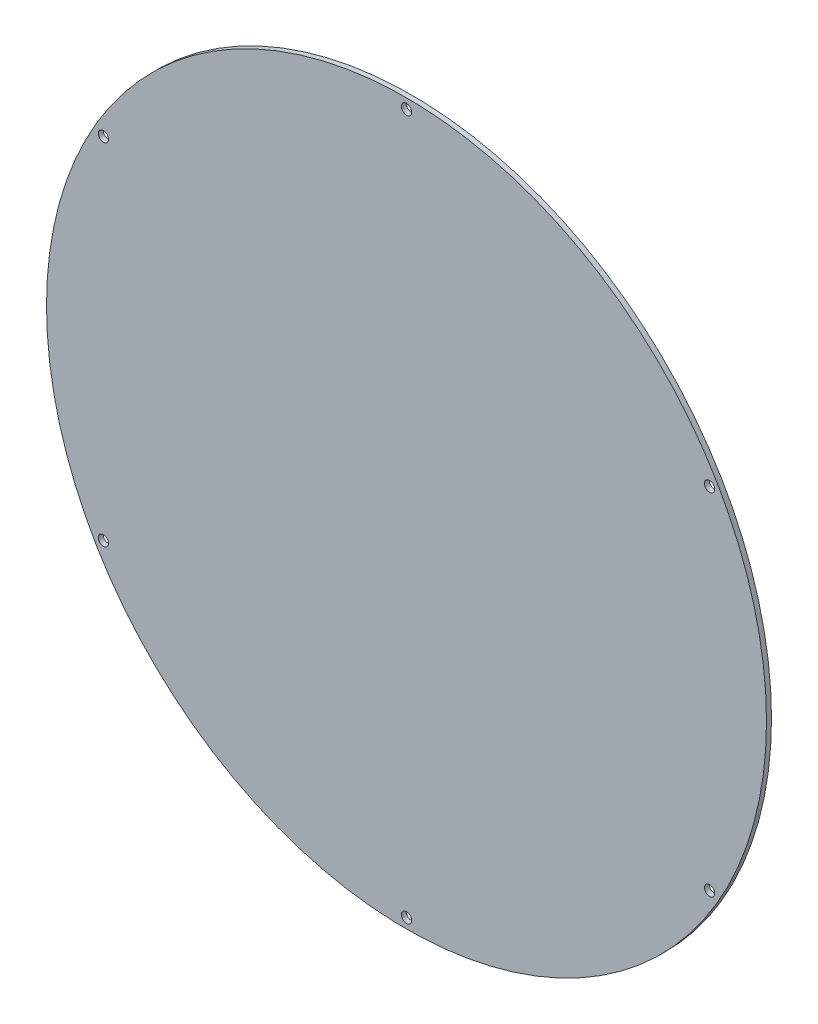
ISO-10303-21;
HEADER;
FILE_DESCRIPTION(('STEP AP214'),'2;1');
FILE_NAME('part.step','',(''),(''),'','','');
FILE_SCHEMA(('AUTOMOTIVE_DESIGN { 1 0 10303 214 1 1 1 1 }'));
ENDSEC;
DATA;
#1=APPLICATION_CONTEXT('core data for automotive mechanical design processes');
#2=APPLICATION_PROTOCOL_DEFINITION('international standard','automotive_design',2000,#1);
#3=PRODUCT_CONTEXT('',#1,'mechanical');
#4=PRODUCT('Part','Part','',(#3));
#5=PRODUCT_RELATED_PRODUCT_CATEGORY('part','',(#4));
#6=PRODUCT_DEFINITION_FORMATION('','',#4);
#7=PRODUCT_DEFINITION_CONTEXT('part definition',#1,'design');
#8=PRODUCT_DEFINITION('design','',#6,#7);
#9=PRODUCT_DEFINITION_SHAPE('','',#8);
#10=(LENGTH_UNIT() NAMED_UNIT(*) SI_UNIT(.MILLI.,.METRE.));
#11=(NAMED_UNIT(*) PLANE_ANGLE_UNIT() SI_UNIT($,.RADIAN.));
#12=(NAMED_UNIT(*) SI_UNIT($,.STERADIAN.) SOLID_ANGLE_UNIT());
#13=UNCERTAINTY_MEASURE_WITH_UNIT(LENGTH_MEASURE(1.E-05),#10,'distance_accuracy_value','');
#14=(GEOMETRIC_REPRESENTATION_CONTEXT(3) GLOBAL_UNCERTAINTY_ASSIGNED_CONTEXT((#13)) GLOBAL_UNIT_ASSIGNED_CONTEXT((#10,
#11,#12)) REPRESENTATION_CONTEXT('',''));
#15=CARTESIAN_POINT('',(0.,0.,0.));
#16=DIRECTION('',(0.,0.,1.));
#17=DIRECTION('',(1.,0.,0.));
#18=AXIS2_PLACEMENT_3D('',#15,#16,#17);
#19=CARTESIAN_POINT('',(0.,0.,1.5875));
#20=DIRECTION('',(0.,0.,-1.));
#21=DIRECTION('',(-1.,0.,0.));
#22=AXIS2_PLACEMENT_3D('',#19,#20,#21);
#23=CYLINDRICAL_SURFACE('',#22,114.3);
#24=CARTESIAN_POINT('',(0.,0.,1.5875));
#25=DIRECTION('',(0.,0.,1.));
#26=DIRECTION('',(1.,0.,0.));
#27=AXIS2_PLACEMENT_3D('',#24,#25,#26);
#28=CIRCLE('',#27,114.3);
#29=CARTESIAN_POINT('',(114.3,0.,1.5875));
#30=VERTEX_POINT('',#29);
#31=EDGE_CURVE('E10',#30,#30,#28,.T.);
#32=ORIENTED_EDGE('',*,*,#31,.F.);
#33=EDGE_LOOP('',(#32));
#34=FACE_BOUND('',#33,.T.);
#35=CARTESIAN_POINT('',(0.,0.,0.));
#36=DIRECTION('',(0.,0.,1.));
#37=DIRECTION('',(1.,0.,0.));
#38=AXIS2_PLACEMENT_3D('',#35,#36,#37);
#39=CIRCLE('',#38,114.3);
#40=CARTESIAN_POINT('',(114.3,0.,0.));
#41=VERTEX_POINT('',#40);
#42=EDGE_CURVE('E33',#41,#41,#39,.T.);
#43=ORIENTED_EDGE('',*,*,#42,.T.);
#44=EDGE_LOOP('',(#43));
#45=FACE_BOUND('',#44,.T.);
#46=ADVANCED_FACE('F30',(#34,#45),#23,.T.);
#47=CARTESIAN_POINT('',(0.,0.,1.5875));
#48=DIRECTION('',(0.,0.,1.));
#49=DIRECTION('',(1.,0.,0.));
#50=AXIS2_PLACEMENT_3D('',#47,#48,#49);
#51=PLANE('',#50);
#52=CARTESIAN_POINT('',(7.75981727557886E-13,111.125,1.5875));
#53=DIRECTION('',(0.,0.,1.));
#54=DIRECTION('',(1.,0.,0.));
#55=AXIS2_PLACEMENT_3D('',#52,#53,#54);
#56=CIRCLE('',#55,1.63194999999999);
#57=CARTESIAN_POINT('',(1.63195000000076,111.125,1.5875));
#58=VERTEX_POINT('',#57);
#59=EDGE_CURVE('E74',#58,#58,#56,.T.);
#60=ORIENTED_EDGE('',*,*,#59,.F.);
#61=EDGE_LOOP('',(#60));
#62=FACE_BOUND('',#61,.T.);
#63=CARTESIAN_POINT('',(96.2370729955463,55.5624999999991,1.5875));
#64=DIRECTION('',(0.,0.,1.));
#65=DIRECTION('',(1.,0.,0.));
#66=AXIS2_PLACEMENT_3D('',#63,#64,#65);
#67=CIRCLE('',#66,1.63194999999999);
#68=CARTESIAN_POINT('',(97.8690229955463,55.5624999999991,1.5875));
#69=VERTEX_POINT('',#68);
#70=EDGE_CURVE('E68',#69,#69,#67,.T.);
#71=ORIENTED_EDGE('',*,*,#70,.F.);
#72=EDGE_LOOP('',(#71));
#73=FACE_BOUND('',#72,.T.);
#74=CARTESIAN_POINT('',(96.2370729955451,-55.5625000000011,1.5875));
#75=DIRECTION('',(0.,0.,1.));
#76=DIRECTION('',(1.,0.,0.));
#77=AXIS2_PLACEMENT_3D('',#74,#75,#76);
#78=CIRCLE('',#77,1.63194999999999);
#79=CARTESIAN_POINT('',(97.8690229955451,-55.5625000000011,1.5875));
#80=VERTEX_POINT('',#79);
#81=EDGE_CURVE('E62',#80,#80,#78,.T.);
#82=ORIENTED_EDGE('',*,*,#81,.F.);
#83=EDGE_LOOP('',(#82));
#84=FACE_BOUND('',#83,.T.);
#85=CARTESIAN_POINT('',(0.,-111.125,1.5875));
#86=DIRECTION('',(0.,0.,1.));
#87=DIRECTION('',(1.,0.,0.));
#88=AXIS2_PLACEMENT_3D('',#85,#86,#87);
#89=CIRCLE('',#88,1.63194999999999);
#90=CARTESIAN_POINT('',(1.63194999999999,-111.125,1.5875));
#91=VERTEX_POINT('',#90);
#92=EDGE_CURVE('E56',#91,#91,#89,.T.);
#93=ORIENTED_EDGE('',*,*,#92,.F.);
#94=EDGE_LOOP('',(#93));
#95=FACE_BOUND('',#94,.T.);
#96=CARTESIAN_POINT('',(-96.2370729955459,-55.5624999999998,1.5875));
#97=DIRECTION('',(0.,0.,1.));
#98=DIRECTION('',(1.,0.,0.));
#99=AXIS2_PLACEMENT_3D('',#96,#97,#98);
#100=CIRCLE('',#99,1.63194999999999);
#101=CARTESIAN_POINT('',(-94.6051229955459,-55.5624999999998,1.5875));
#102=VERTEX_POINT('',#101);
#103=EDGE_CURVE('E50',#102,#102,#100,.T.);
#104=ORIENTED_EDGE('',*,*,#103,.F.);
#105=EDGE_LOOP('',(#104));
#106=FACE_BOUND('',#105,.T.);
#107=CARTESIAN_POINT('',(-96.2370729955455,55.5625000000005,1.5875));
#108=DIRECTION('',(0.,0.,1.));
#109=DIRECTION('',(1.,0.,0.));
#110=AXIS2_PLACEMENT_3D('',#107,#108,#109);
#111=CIRCLE('',#110,1.63194999999999);
#112=CARTESIAN_POINT('',(-94.6051229955455,55.5625000000005,1.5875));
#113=VERTEX_POINT('',#112);
#114=EDGE_CURVE('E44',#113,#113,#111,.T.);
#115=ORIENTED_EDGE('',*,*,#114,.F.);
#116=EDGE_LOOP('',(#115));
#117=FACE_BOUND('',#116,.T.);
#118=ORIENTED_EDGE('',*,*,#31,.T.);
#119=EDGE_LOOP('',(#118));
#120=FACE_BOUND('',#119,.T.);
#121=ADVANCED_FACE('F80',(#62,#73,#84,#95,#106,#117,#120),#51,.T.);
#122=CARTESIAN_POINT('',(0.,0.,0.));
#123=DIRECTION('',(0.,0.,1.));
#124=DIRECTION('',(1.,0.,0.));
#125=AXIS2_PLACEMENT_3D('',#122,#123,#124);
#126=PLANE('',#125);
#127=CARTESIAN_POINT('',(7.75981727557886E-13,111.125,0.));
#128=DIRECTION('',(0.,0.,1.));
#129=DIRECTION('',(1.,0.,0.));
#130=AXIS2_PLACEMENT_3D('',#127,#128,#129);
#131=CIRCLE('',#130,1.63195);
#132=CARTESIAN_POINT('',(1.63195000000077,111.125,0.));
#133=VERTEX_POINT('',#132);
#134=EDGE_CURVE('E71',#133,#133,#131,.T.);
#135=ORIENTED_EDGE('',*,*,#134,.T.);
#136=EDGE_LOOP('',(#135));
#137=FACE_BOUND('',#136,.T.);
#138=CARTESIAN_POINT('',(96.2370729955463,55.5624999999991,0.));
#139=DIRECTION('',(0.,0.,1.));
#140=DIRECTION('',(1.,0.,0.));
#141=AXIS2_PLACEMENT_3D('',#138,#139,#140);
#142=CIRCLE('',#141,1.63194999999999);
#143=CARTESIAN_POINT('',(97.8690229955463,55.5624999999991,0.));
#144=VERTEX_POINT('',#143);
#145=EDGE_CURVE('E65',#144,#144,#142,.T.);
#146=ORIENTED_EDGE('',*,*,#145,.T.);
#147=EDGE_LOOP('',(#146));
#148=FACE_BOUND('',#147,.T.);
#149=CARTESIAN_POINT('',(96.2370729955451,-55.5625000000011,0.));
#150=DIRECTION('',(0.,0.,1.));
#151=DIRECTION('',(1.,0.,0.));
#152=AXIS2_PLACEMENT_3D('',#149,#150,#151);
#153=CIRCLE('',#152,1.63194999999999);
#154=CARTESIAN_POINT('',(97.8690229955451,-55.5625000000011,0.));
#155=VERTEX_POINT('',#154);
#156=EDGE_CURVE('E59',#155,#155,#153,.T.);
#157=ORIENTED_EDGE('',*,*,#156,.T.);
#158=EDGE_LOOP('',(#157));
#159=FACE_BOUND('',#158,.T.);
#160=CARTESIAN_POINT('',(0.,-111.125,0.));
#161=DIRECTION('',(0.,0.,1.));
#162=DIRECTION('',(1.,0.,0.));
#163=AXIS2_PLACEMENT_3D('',#160,#161,#162);
#164=CIRCLE('',#163,1.63195);
#165=CARTESIAN_POINT('',(1.63195,-111.125,0.));
#166=VERTEX_POINT('',#165);
#167=EDGE_CURVE('E53',#166,#166,#164,.T.);
#168=ORIENTED_EDGE('',*,*,#167,.T.);
#169=EDGE_LOOP('',(#168));
#170=FACE_BOUND('',#169,.T.);
#171=CARTESIAN_POINT('',(-96.2370729955459,-55.5624999999998,0.));
#172=DIRECTION('',(0.,0.,1.));
#173=DIRECTION('',(1.,0.,0.));
#174=AXIS2_PLACEMENT_3D('',#171,#172,#173);
#175=CIRCLE('',#174,1.63194999999999);
#176=CARTESIAN_POINT('',(-94.6051229955459,-55.5624999999998,0.));
#177=VERTEX_POINT('',#176);
#178=EDGE_CURVE('E47',#177,#177,#175,.T.);
#179=ORIENTED_EDGE('',*,*,#178,.T.);
#180=EDGE_LOOP('',(#179));
#181=FACE_BOUND('',#180,.T.);
#182=CARTESIAN_POINT('',(-96.2370729955455,55.5625000000005,0.));
#183=DIRECTION('',(0.,0.,1.));
#184=DIRECTION('',(1.,0.,0.));
#185=AXIS2_PLACEMENT_3D('',#182,#183,#184);
#186=CIRCLE('',#185,1.63194999999999);
#187=CARTESIAN_POINT('',(-94.6051229955455,55.5625000000005,0.));
#188=VERTEX_POINT('',#187);
#189=EDGE_CURVE('E40',#188,#188,#186,.T.);
#190=ORIENTED_EDGE('',*,*,#189,.T.);
#191=EDGE_LOOP('',(#190));
#192=FACE_BOUND('',#191,.T.);
#193=ORIENTED_EDGE('',*,*,#42,.F.);
#194=EDGE_LOOP('',(#193));
#195=FACE_BOUND('',#194,.T.);
#196=ADVANCED_FACE('F83',(#137,#148,#159,#170,#181,#192,#195),#126,.F.);
#197=CARTESIAN_POINT('',(-96.2370729955455,55.5625000000005,1.5875));
#198=DIRECTION('',(0.,0.,1.));
#199=DIRECTION('',(1.,0.,0.));
#200=AXIS2_PLACEMENT_3D('',#197,#198,#199);
#201=CYLINDRICAL_SURFACE('',#200,1.63194999999999);
#202=ORIENTED_EDGE('',*,*,#189,.F.);
#203=EDGE_LOOP('',(#202));
#204=FACE_BOUND('',#203,.T.);
#205=ORIENTED_EDGE('',*,*,#114,.T.);
#206=EDGE_LOOP('',(#205));
#207=FACE_BOUND('',#206,.T.);
#208=ADVANCED_FACE('F95',(#204,#207),#201,.F.);
#209=CARTESIAN_POINT('',(-96.2370729955459,-55.5624999999998,1.5875));
#210=DIRECTION('',(0.,0.,1.));
#211=DIRECTION('',(1.,0.,0.));
#212=AXIS2_PLACEMENT_3D('',#209,#210,#211);
#213=CYLINDRICAL_SURFACE('',#212,1.63194999999999);
#214=ORIENTED_EDGE('',*,*,#178,.F.);
#215=EDGE_LOOP('',(#214));
#216=FACE_BOUND('',#215,.T.);
#217=ORIENTED_EDGE('',*,*,#103,.T.);
#218=EDGE_LOOP('',(#217));
#219=FACE_BOUND('',#218,.T.);
#220=ADVANCED_FACE('F97',(#216,#219),#213,.F.);
#221=CARTESIAN_POINT('',(0.,-111.125,1.5875));
#222=DIRECTION('',(0.,0.,1.));
#223=DIRECTION('',(1.,0.,0.));
#224=AXIS2_PLACEMENT_3D('',#221,#222,#223);
#225=CYLINDRICAL_SURFACE('',#224,1.63194999999999);
#226=ORIENTED_EDGE('',*,*,#167,.F.);
#227=EDGE_LOOP('',(#226));
#228=FACE_BOUND('',#227,.T.);
#229=ORIENTED_EDGE('',*,*,#92,.T.);
#230=EDGE_LOOP('',(#229));
#231=FACE_BOUND('',#230,.T.);
#232=ADVANCED_FACE('F104',(#228,#231),#225,.F.);
#233=CARTESIAN_POINT('',(96.2370729955451,-55.5625000000011,1.5875));
#234=DIRECTION('',(0.,0.,1.));
#235=DIRECTION('',(1.,0.,0.));
#236=AXIS2_PLACEMENT_3D('',#233,#234,#235);
#237=CYLINDRICAL_SURFACE('',#236,1.63194999999999);
#238=ORIENTED_EDGE('',*,*,#156,.F.);
#239=EDGE_LOOP('',(#238));
#240=FACE_BOUND('',#239,.T.);
#241=ORIENTED_EDGE('',*,*,#81,.T.);
#242=EDGE_LOOP('',(#241));
#243=FACE_BOUND('',#242,.T.);
#244=ADVANCED_FACE('F143',(#240,#243),#237,.F.);
#245=CARTESIAN_POINT('',(96.2370729955463,55.5624999999991,1.5875));
#246=DIRECTION('',(0.,0.,1.));
#247=DIRECTION('',(1.,0.,0.));
#248=AXIS2_PLACEMENT_3D('',#245,#246,#247);
#249=CYLINDRICAL_SURFACE('',#248,1.63194999999999);
#250=ORIENTED_EDGE('',*,*,#145,.F.);
#251=EDGE_LOOP('',(#250));
#252=FACE_BOUND('',#251,.T.);
#253=ORIENTED_EDGE('',*,*,#70,.T.);
#254=EDGE_LOOP('',(#253));
#255=FACE_BOUND('',#254,.T.);
#256=ADVANCED_FACE('F153',(#252,#255),#249,.F.);
#257=CARTESIAN_POINT('',(7.75981727557886E-13,111.125,1.5875));
#258=DIRECTION('',(0.,0.,1.));
#259=DIRECTION('',(1.,0.,0.));
#260=AXIS2_PLACEMENT_3D('',#257,#258,#259);
#261=CYLINDRICAL_SURFACE('',#260,1.63194999999999);
#262=ORIENTED_EDGE('',*,*,#134,.F.);
#263=EDGE_LOOP('',(#262));
#264=FACE_BOUND('',#263,.T.);
#265=ORIENTED_EDGE('',*,*,#59,.T.);
#266=EDGE_LOOP('',(#265));
#267=FACE_BOUND('',#266,.T.);
#268=ADVANCED_FACE('F78',(#264,#267),#261,.F.);
#269=CLOSED_SHELL('',(#46,#121,#196,#208,#220,#232,#244,#256,#268));
#270=MANIFOLD_SOLID_BREP('B2',#269);
#271=ADVANCED_BREP_SHAPE_REPRESENTATION('',(#18,#270),#14);
#272=SHAPE_DEFINITION_REPRESENTATION(#9,#271);
ENDSEC;
END-ISO-10303-21;
